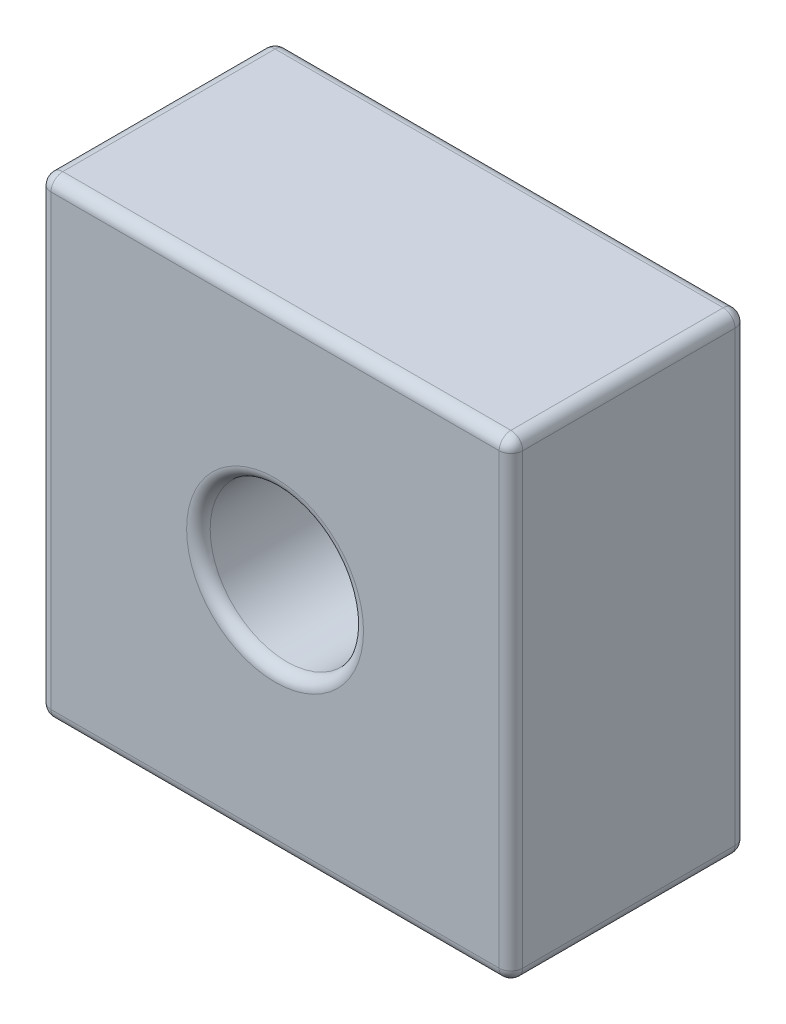
ISO-10303-21;
HEADER;
FILE_DESCRIPTION(('STEP AP214'),'2;1');
FILE_NAME('part.step','',(''),(''),'','','');
FILE_SCHEMA(('AUTOMOTIVE_DESIGN { 1 0 10303 214 1 1 1 1 }'));
ENDSEC;
DATA;
#1=APPLICATION_CONTEXT('core data for automotive mechanical design processes');
#2=APPLICATION_PROTOCOL_DEFINITION('international standard','automotive_design',2000,#1);
#3=PRODUCT_CONTEXT('',#1,'mechanical');
#4=PRODUCT('Part','Part','',(#3));
#5=PRODUCT_RELATED_PRODUCT_CATEGORY('part','',(#4));
#6=PRODUCT_DEFINITION_FORMATION('','',#4);
#7=PRODUCT_DEFINITION_CONTEXT('part definition',#1,'design');
#8=PRODUCT_DEFINITION('design','',#6,#7);
#9=PRODUCT_DEFINITION_SHAPE('','',#8);
#10=(LENGTH_UNIT() NAMED_UNIT(*) SI_UNIT(.MILLI.,.METRE.));
#11=(NAMED_UNIT(*) PLANE_ANGLE_UNIT() SI_UNIT($,.RADIAN.));
#12=(NAMED_UNIT(*) SI_UNIT($,.STERADIAN.) SOLID_ANGLE_UNIT());
#13=UNCERTAINTY_MEASURE_WITH_UNIT(LENGTH_MEASURE(1.E-05),#10,'distance_accuracy_value','');
#14=(GEOMETRIC_REPRESENTATION_CONTEXT(3) GLOBAL_UNCERTAINTY_ASSIGNED_CONTEXT((#13)) GLOBAL_UNIT_ASSIGNED_CONTEXT((#10,
#11,#12)) REPRESENTATION_CONTEXT('',''));
#15=CARTESIAN_POINT('',(0.,0.,0.));
#16=DIRECTION('',(0.,0.,1.));
#17=DIRECTION('',(1.,0.,0.));
#18=AXIS2_PLACEMENT_3D('',#15,#16,#17);
#19=CARTESIAN_POINT('',(0.,0.,10.));
#20=DIRECTION('',(0.,0.,1.));
#21=DIRECTION('',(1.,0.,0.));
#22=AXIS2_PLACEMENT_3D('',#19,#20,#21);
#23=PLANE('',#22);
#24=CARTESIAN_POINT('',(0.,0.,10.));
#25=DIRECTION('',(0.,0.,1.));
#26=DIRECTION('',(1.,0.,0.));
#27=AXIS2_PLACEMENT_3D('',#24,#25,#26);
#28=CIRCLE('',#27,3.75);
#29=CARTESIAN_POINT('',(3.75,0.,10.));
#30=VERTEX_POINT('',#29);
#31=EDGE_CURVE('E171',#30,#30,#28,.F.);
#32=ORIENTED_EDGE('',*,*,#31,.T.);
#33=EDGE_LOOP('',(#32));
#34=FACE_BOUND('',#33,.T.);
#35=DIRECTION('',(-1.,0.,0.));
#36=VECTOR('',#35,1.);
#37=CARTESIAN_POINT('',(-10.,9.50000000000001,10.));
#38=LINE('',#37,#36);
#39=CARTESIAN_POINT('',(9.5,9.50000000000001,10.));
#40=VERTEX_POINT('',#39);
#41=CARTESIAN_POINT('',(-9.5,9.50000000000001,10.));
#42=VERTEX_POINT('',#41);
#43=EDGE_CURVE('E135',#40,#42,#38,.T.);
#44=ORIENTED_EDGE('',*,*,#43,.T.);
#45=DIRECTION('',(0.,-1.,0.));
#46=VECTOR('',#45,1.);
#47=CARTESIAN_POINT('',(-9.5,-9.99999999999999,10.));
#48=LINE('',#47,#46);
#49=CARTESIAN_POINT('',(-9.5,-9.49999999999999,10.));
#50=VERTEX_POINT('',#49);
#51=EDGE_CURVE('E131',#42,#50,#48,.T.);
#52=ORIENTED_EDGE('',*,*,#51,.T.);
#53=DIRECTION('',(1.,0.,0.));
#54=VECTOR('',#53,1.);
#55=CARTESIAN_POINT('',(10.,-9.49999999999999,10.));
#56=LINE('',#55,#54);
#57=CARTESIAN_POINT('',(9.5,-9.49999999999999,10.));
#58=VERTEX_POINT('',#57);
#59=EDGE_CURVE('E124',#50,#58,#56,.T.);
#60=ORIENTED_EDGE('',*,*,#59,.T.);
#61=DIRECTION('',(0.,1.,0.));
#62=VECTOR('',#61,1.);
#63=CARTESIAN_POINT('',(9.5,10.,10.));
#64=LINE('',#63,#62);
#65=EDGE_CURVE('E128',#58,#40,#64,.T.);
#66=ORIENTED_EDGE('',*,*,#65,.T.);
#67=EDGE_LOOP('',(#44,#52,#60,#66));
#68=FACE_BOUND('',#67,.T.);
#69=ADVANCED_FACE('F33',(#34,#68),#23,.T.);
#70=CARTESIAN_POINT('',(0.,0.,0.));
#71=DIRECTION('',(0.,0.,1.));
#72=DIRECTION('',(1.,0.,0.));
#73=AXIS2_PLACEMENT_3D('',#70,#71,#72);
#74=PLANE('',#73);
#75=CARTESIAN_POINT('',(0.,0.,0.));
#76=DIRECTION('',(0.,0.,1.));
#77=DIRECTION('',(1.,0.,0.));
#78=AXIS2_PLACEMENT_3D('',#75,#76,#77);
#79=CIRCLE('',#78,3.75);
#80=CARTESIAN_POINT('',(3.75,0.,0.));
#81=VERTEX_POINT('',#80);
#82=EDGE_CURVE('E11',#81,#81,#79,.T.);
#83=ORIENTED_EDGE('',*,*,#82,.T.);
#84=EDGE_LOOP('',(#83));
#85=FACE_BOUND('',#84,.T.);
#86=DIRECTION('',(0.,1.,0.));
#87=VECTOR('',#86,1.);
#88=CARTESIAN_POINT('',(9.5,0.,0.));
#89=LINE('',#88,#87);
#90=CARTESIAN_POINT('',(9.5,9.50000000000001,0.));
#91=VERTEX_POINT('',#90);
#92=CARTESIAN_POINT('',(9.5,-9.49999999999999,0.));
#93=VERTEX_POINT('',#92);
#94=EDGE_CURVE('E212',#91,#93,#89,.F.);
#95=ORIENTED_EDGE('',*,*,#94,.T.);
#96=DIRECTION('',(1.,0.,0.));
#97=VECTOR('',#96,1.);
#98=CARTESIAN_POINT('',(0.,-9.49999999999999,0.));
#99=LINE('',#98,#97);
#100=CARTESIAN_POINT('',(-9.5,-9.49999999999999,0.));
#101=VERTEX_POINT('',#100);
#102=EDGE_CURVE('E42',#93,#101,#99,.F.);
#103=ORIENTED_EDGE('',*,*,#102,.T.);
#104=DIRECTION('',(0.,-1.,0.));
#105=VECTOR('',#104,1.);
#106=CARTESIAN_POINT('',(-9.5,0.,0.));
#107=LINE('',#106,#105);
#108=CARTESIAN_POINT('',(-9.5,9.50000000000001,0.));
#109=VERTEX_POINT('',#108);
#110=EDGE_CURVE('E210',#101,#109,#107,.F.);
#111=ORIENTED_EDGE('',*,*,#110,.T.);
#112=DIRECTION('',(-1.,0.,0.));
#113=VECTOR('',#112,1.);
#114=CARTESIAN_POINT('',(0.,9.50000000000001,0.));
#115=LINE('',#114,#113);
#116=EDGE_CURVE('E208',#109,#91,#115,.F.);
#117=ORIENTED_EDGE('',*,*,#116,.T.);
#118=EDGE_LOOP('',(#95,#103,#111,#117));
#119=FACE_BOUND('',#118,.T.);
#120=ADVANCED_FACE('F278',(#85,#119),#74,.F.);
#121=CARTESIAN_POINT('',(-10.,-9.99999999999999,10.));
#122=DIRECTION('',(1.,0.,0.));
#123=DIRECTION('',(0.,0.,-1.));
#124=AXIS2_PLACEMENT_3D('',#121,#122,#123);
#125=PLANE('',#124);
#126=DIRECTION('',(0.,-1.,0.));
#127=VECTOR('',#126,1.);
#128=CARTESIAN_POINT('',(-10.,10.,9.5));
#129=LINE('',#128,#127);
#130=CARTESIAN_POINT('',(-10.,-9.49999999999999,9.5));
#131=VERTEX_POINT('',#130);
#132=CARTESIAN_POINT('',(-10.,9.50000000000001,9.5));
#133=VERTEX_POINT('',#132);
#134=EDGE_CURVE('E194',#131,#133,#129,.F.);
#135=ORIENTED_EDGE('',*,*,#134,.T.);
#136=DIRECTION('',(0.,0.,-1.));
#137=VECTOR('',#136,1.);
#138=CARTESIAN_POINT('',(-10.,9.50000000000001,10.));
#139=LINE('',#138,#137);
#140=CARTESIAN_POINT('',(-10.,9.50000000000001,0.5));
#141=VERTEX_POINT('',#140);
#142=EDGE_CURVE('E197',#133,#141,#139,.T.);
#143=ORIENTED_EDGE('',*,*,#142,.T.);
#144=DIRECTION('',(0.,-1.,0.));
#145=VECTOR('',#144,1.);
#146=CARTESIAN_POINT('',(-10.,-9.99999999999999,0.5));
#147=LINE('',#146,#145);
#148=CARTESIAN_POINT('',(-10.,-9.49999999999999,0.5));
#149=VERTEX_POINT('',#148);
#150=EDGE_CURVE('E192',#141,#149,#147,.T.);
#151=ORIENTED_EDGE('',*,*,#150,.T.);
#152=DIRECTION('',(0.,0.,-1.));
#153=VECTOR('',#152,1.);
#154=CARTESIAN_POINT('',(-10.,-9.49999999999999,10.));
#155=LINE('',#154,#153);
#156=EDGE_CURVE('E190',#149,#131,#155,.F.);
#157=ORIENTED_EDGE('',*,*,#156,.T.);
#158=EDGE_LOOP('',(#135,#143,#151,#157));
#159=FACE_BOUND('',#158,.T.);
#160=ADVANCED_FACE('F280',(#159),#125,.F.);
#161=CARTESIAN_POINT('',(10.,-9.99999999999999,10.));
#162=DIRECTION('',(0.,1.,0.));
#163=DIRECTION('',(-1.,0.,0.));
#164=AXIS2_PLACEMENT_3D('',#161,#162,#163);
#165=PLANE('',#164);
#166=DIRECTION('',(0.,0.,-1.));
#167=VECTOR('',#166,1.);
#168=CARTESIAN_POINT('',(9.5,-9.99999999999999,10.));
#169=LINE('',#168,#167);
#170=CARTESIAN_POINT('',(9.5,-9.99999999999999,0.5));
#171=VERTEX_POINT('',#170);
#172=CARTESIAN_POINT('',(9.5,-9.99999999999999,9.5));
#173=VERTEX_POINT('',#172);
#174=EDGE_CURVE('E187',#171,#173,#169,.F.);
#175=ORIENTED_EDGE('',*,*,#174,.T.);
#176=DIRECTION('',(1.,0.,0.));
#177=VECTOR('',#176,1.);
#178=CARTESIAN_POINT('',(-10.,-9.99999999999999,9.5));
#179=LINE('',#178,#177);
#180=CARTESIAN_POINT('',(-9.5,-9.99999999999999,9.5));
#181=VERTEX_POINT('',#180);
#182=EDGE_CURVE('E143',#173,#181,#179,.F.);
#183=ORIENTED_EDGE('',*,*,#182,.T.);
#184=DIRECTION('',(0.,0.,-1.));
#185=VECTOR('',#184,1.);
#186=CARTESIAN_POINT('',(-9.5,-9.99999999999999,10.));
#187=LINE('',#186,#185);
#188=CARTESIAN_POINT('',(-9.5,-9.99999999999999,0.5));
#189=VERTEX_POINT('',#188);
#190=EDGE_CURVE('E183',#181,#189,#187,.T.);
#191=ORIENTED_EDGE('',*,*,#190,.T.);
#192=DIRECTION('',(1.,0.,0.));
#193=VECTOR('',#192,1.);
#194=CARTESIAN_POINT('',(10.,-9.99999999999999,0.5));
#195=LINE('',#194,#193);
#196=EDGE_CURVE('E185',#189,#171,#195,.T.);
#197=ORIENTED_EDGE('',*,*,#196,.T.);
#198=EDGE_LOOP('',(#175,#183,#191,#197));
#199=FACE_BOUND('',#198,.T.);
#200=ADVANCED_FACE('F307',(#199),#165,.F.);
#201=CARTESIAN_POINT('',(10.,-9.99999999999999,10.));
#202=DIRECTION('',(-1.,0.,0.));
#203=DIRECTION('',(0.,-1.,0.));
#204=AXIS2_PLACEMENT_3D('',#201,#202,#203);
#205=PLANE('',#204);
#206=DIRECTION('',(0.,1.,0.));
#207=VECTOR('',#206,1.);
#208=CARTESIAN_POINT('',(10.,-9.99999999999999,9.5));
#209=LINE('',#208,#207);
#210=CARTESIAN_POINT('',(10.,9.50000000000001,9.5));
#211=VERTEX_POINT('',#210);
#212=CARTESIAN_POINT('',(10.,-9.49999999999999,9.5));
#213=VERTEX_POINT('',#212);
#214=EDGE_CURVE('E203',#211,#213,#209,.F.);
#215=ORIENTED_EDGE('',*,*,#214,.T.);
#216=DIRECTION('',(0.,0.,-1.));
#217=VECTOR('',#216,1.);
#218=CARTESIAN_POINT('',(10.,-9.49999999999999,10.));
#219=LINE('',#218,#217);
#220=CARTESIAN_POINT('',(10.,-9.49999999999999,0.5));
#221=VERTEX_POINT('',#220);
#222=EDGE_CURVE('E205',#213,#221,#219,.T.);
#223=ORIENTED_EDGE('',*,*,#222,.T.);
#224=DIRECTION('',(0.,1.,0.));
#225=VECTOR('',#224,1.);
#226=CARTESIAN_POINT('',(10.,-9.99999999999999,0.5));
#227=LINE('',#226,#225);
#228=CARTESIAN_POINT('',(10.,9.50000000000001,0.5));
#229=VERTEX_POINT('',#228);
#230=EDGE_CURVE('E199',#221,#229,#227,.T.);
#231=ORIENTED_EDGE('',*,*,#230,.T.);
#232=DIRECTION('',(0.,0.,-1.));
#233=VECTOR('',#232,1.);
#234=CARTESIAN_POINT('',(10.,9.50000000000001,10.));
#235=LINE('',#234,#233);
#236=EDGE_CURVE('E201',#229,#211,#235,.F.);
#237=ORIENTED_EDGE('',*,*,#236,.T.);
#238=EDGE_LOOP('',(#215,#223,#231,#237));
#239=FACE_BOUND('',#238,.T.);
#240=ADVANCED_FACE('F300',(#239),#205,.F.);
#241=CARTESIAN_POINT('',(10.,10.,10.));
#242=DIRECTION('',(0.,-1.,0.));
#243=DIRECTION('',(1.,0.,0.));
#244=AXIS2_PLACEMENT_3D('',#241,#242,#243);
#245=PLANE('',#244);
#246=DIRECTION('',(0.,0.,-1.));
#247=VECTOR('',#246,1.);
#248=CARTESIAN_POINT('',(-9.5,10.,10.));
#249=LINE('',#248,#247);
#250=CARTESIAN_POINT('',(-9.5,10.,0.5));
#251=VERTEX_POINT('',#250);
#252=CARTESIAN_POINT('',(-9.5,10.,9.5));
#253=VERTEX_POINT('',#252);
#254=EDGE_CURVE('E174',#251,#253,#249,.F.);
#255=ORIENTED_EDGE('',*,*,#254,.T.);
#256=DIRECTION('',(-1.,0.,0.));
#257=VECTOR('',#256,1.);
#258=CARTESIAN_POINT('',(10.,10.,9.5));
#259=LINE('',#258,#257);
#260=CARTESIAN_POINT('',(9.5,10.,9.5));
#261=VERTEX_POINT('',#260);
#262=EDGE_CURVE('E180',#253,#261,#259,.F.);
#263=ORIENTED_EDGE('',*,*,#262,.T.);
#264=DIRECTION('',(0.,0.,-1.));
#265=VECTOR('',#264,1.);
#266=CARTESIAN_POINT('',(9.5,10.,10.));
#267=LINE('',#266,#265);
#268=CARTESIAN_POINT('',(9.5,10.,0.5));
#269=VERTEX_POINT('',#268);
#270=EDGE_CURVE('E178',#261,#269,#267,.T.);
#271=ORIENTED_EDGE('',*,*,#270,.T.);
#272=DIRECTION('',(-1.,0.,0.));
#273=VECTOR('',#272,1.);
#274=CARTESIAN_POINT('',(10.,10.,0.5));
#275=LINE('',#274,#273);
#276=EDGE_CURVE('E176',#269,#251,#275,.T.);
#277=ORIENTED_EDGE('',*,*,#276,.T.);
#278=EDGE_LOOP('',(#255,#263,#271,#277));
#279=FACE_BOUND('',#278,.T.);
#280=ADVANCED_FACE('F328',(#279),#245,.F.);
#281=CARTESIAN_POINT('',(0.,0.,10.));
#282=DIRECTION('',(0.,0.,-1.));
#283=DIRECTION('',(-1.,0.,0.));
#284=AXIS2_PLACEMENT_3D('',#281,#282,#283);
#285=CYLINDRICAL_SURFACE('',#284,3.25);
#286=CARTESIAN_POINT('',(0.,0.,9.5));
#287=DIRECTION('',(0.,0.,1.));
#288=DIRECTION('',(1.,0.,0.));
#289=AXIS2_PLACEMENT_3D('',#286,#287,#288);
#290=CIRCLE('',#289,3.25);
#291=CARTESIAN_POINT('',(3.25,0.,9.5));
#292=VERTEX_POINT('',#291);
#293=EDGE_CURVE('E162',#292,#292,#290,.T.);
#294=ORIENTED_EDGE('',*,*,#293,.T.);
#295=EDGE_LOOP('',(#294));
#296=FACE_BOUND('',#295,.T.);
#297=CARTESIAN_POINT('',(0.,0.,0.5));
#298=DIRECTION('',(0.,0.,1.));
#299=DIRECTION('',(1.,0.,0.));
#300=AXIS2_PLACEMENT_3D('',#297,#298,#299);
#301=CIRCLE('',#300,3.25);
#302=CARTESIAN_POINT('',(3.25,0.,0.5));
#303=VERTEX_POINT('',#302);
#304=EDGE_CURVE('E165',#303,#303,#301,.F.);
#305=ORIENTED_EDGE('',*,*,#304,.T.);
#306=EDGE_LOOP('',(#305));
#307=FACE_BOUND('',#306,.T.);
#308=ADVANCED_FACE('F271',(#296,#307),#285,.F.);
#309=CARTESIAN_POINT('',(0.,0.,9.5));
#310=DIRECTION('',(0.,0.,1.));
#311=DIRECTION('',(1.,0.,0.));
#312=AXIS2_PLACEMENT_3D('',#309,#310,#311);
#313=TOROIDAL_SURFACE('',#312,3.75,0.5);
#314=ORIENTED_EDGE('',*,*,#31,.F.);
#315=EDGE_LOOP('',(#314));
#316=FACE_BOUND('',#315,.T.);
#317=ORIENTED_EDGE('',*,*,#293,.F.);
#318=EDGE_LOOP('',(#317));
#319=FACE_BOUND('',#318,.T.);
#320=ADVANCED_FACE('F376',(#316,#319),#313,.T.);
#321=CARTESIAN_POINT('',(10.,-9.49999999999999,0.5));
#322=DIRECTION('',(1.,0.,0.));
#323=DIRECTION('',(0.,1.,0.));
#324=AXIS2_PLACEMENT_3D('',#321,#322,#323);
#325=CYLINDRICAL_SURFACE('',#324,0.5);
#326=CARTESIAN_POINT('',(9.5,-9.49999999999999,0.5));
#327=DIRECTION('',(1.,0.,0.));
#328=DIRECTION('',(0.,0.,-1.));
#329=AXIS2_PLACEMENT_3D('',#326,#327,#328);
#330=CIRCLE('',#329,0.5);
#331=EDGE_CURVE('E37',#171,#93,#330,.T.);
#332=ORIENTED_EDGE('',*,*,#331,.F.);
#333=ORIENTED_EDGE('',*,*,#196,.F.);
#334=CARTESIAN_POINT('',(-9.5,-9.49999999999999,0.5));
#335=DIRECTION('',(-1.,0.,0.));
#336=DIRECTION('',(0.,-1.,0.));
#337=AXIS2_PLACEMENT_3D('',#334,#335,#336);
#338=CIRCLE('',#337,0.5);
#339=EDGE_CURVE('E260',#101,#189,#338,.T.);
#340=ORIENTED_EDGE('',*,*,#339,.F.);
#341=ORIENTED_EDGE('',*,*,#102,.F.);
#342=EDGE_LOOP('',(#332,#333,#340,#341));
#343=FACE_BOUND('',#342,.T.);
#344=ADVANCED_FACE('F311',(#343),#325,.T.);
#345=CARTESIAN_POINT('',(9.5,-9.49999999999999,0.5));
#346=DIRECTION('',(0.,0.,1.));
#347=DIRECTION('',(1.,0.,0.));
#348=AXIS2_PLACEMENT_3D('',#345,#346,#347);
#349=SPHERICAL_SURFACE('',#348,0.5);
#350=CARTESIAN_POINT('',(9.5,-9.49999999999999,0.5));
#351=DIRECTION('',(0.,0.,-1.));
#352=DIRECTION('',(-1.,0.,0.));
#353=AXIS2_PLACEMENT_3D('',#350,#351,#352);
#354=CIRCLE('',#353,0.5);
#355=EDGE_CURVE('E257',#171,#221,#354,.F.);
#356=ORIENTED_EDGE('',*,*,#355,.F.);
#357=ORIENTED_EDGE('',*,*,#331,.T.);
#358=CARTESIAN_POINT('',(9.5,-9.49999999999999,0.5));
#359=DIRECTION('',(0.,-1.,0.));
#360=DIRECTION('',(0.,0.,-1.));
#361=AXIS2_PLACEMENT_3D('',#358,#359,#360);
#362=CIRCLE('',#361,0.5);
#363=EDGE_CURVE('E50',#221,#93,#362,.F.);
#364=ORIENTED_EDGE('',*,*,#363,.F.);
#365=EDGE_LOOP('',(#356,#357,#364));
#366=FACE_BOUND('',#365,.T.);
#367=ADVANCED_FACE('F302',(#366),#349,.T.);
#368=CARTESIAN_POINT('',(-9.5,-9.49999999999999,0.5));
#369=DIRECTION('',(0.,0.,1.));
#370=DIRECTION('',(1.,0.,0.));
#371=AXIS2_PLACEMENT_3D('',#368,#369,#370);
#372=SPHERICAL_SURFACE('',#371,0.5);
#373=CARTESIAN_POINT('',(-9.5,-9.49999999999999,0.5));
#374=DIRECTION('',(0.,-1.,0.));
#375=DIRECTION('',(0.,0.,-1.));
#376=AXIS2_PLACEMENT_3D('',#373,#374,#375);
#377=CIRCLE('',#376,0.5);
#378=EDGE_CURVE('E251',#101,#149,#377,.F.);
#379=ORIENTED_EDGE('',*,*,#378,.F.);
#380=ORIENTED_EDGE('',*,*,#339,.T.);
#381=CARTESIAN_POINT('',(-9.5,-9.49999999999999,0.5));
#382=DIRECTION('',(0.,0.,-1.));
#383=DIRECTION('',(-1.,0.,0.));
#384=AXIS2_PLACEMENT_3D('',#381,#382,#383);
#385=CIRCLE('',#384,0.5);
#386=EDGE_CURVE('E254',#149,#189,#385,.F.);
#387=ORIENTED_EDGE('',*,*,#386,.F.);
#388=EDGE_LOOP('',(#379,#380,#387));
#389=FACE_BOUND('',#388,.T.);
#390=ADVANCED_FACE('F313',(#389),#372,.T.);
#391=CARTESIAN_POINT('',(9.5,-9.99999999999999,0.5));
#392=DIRECTION('',(0.,1.,0.));
#393=DIRECTION('',(-1.,0.,0.));
#394=AXIS2_PLACEMENT_3D('',#391,#392,#393);
#395=CYLINDRICAL_SURFACE('',#394,0.5);
#396=ORIENTED_EDGE('',*,*,#363,.T.);
#397=ORIENTED_EDGE('',*,*,#94,.F.);
#398=CARTESIAN_POINT('',(9.5,9.50000000000001,0.5));
#399=DIRECTION('',(0.,1.,0.));
#400=DIRECTION('',(0.,0.,1.));
#401=AXIS2_PLACEMENT_3D('',#398,#399,#400);
#402=CIRCLE('',#401,0.5);
#403=EDGE_CURVE('E245',#229,#91,#402,.T.);
#404=ORIENTED_EDGE('',*,*,#403,.F.);
#405=ORIENTED_EDGE('',*,*,#230,.F.);
#406=EDGE_LOOP('',(#396,#397,#404,#405));
#407=FACE_BOUND('',#406,.T.);
#408=ADVANCED_FACE('F285',(#407),#395,.T.);
#409=CARTESIAN_POINT('',(9.5,-9.49999999999999,10.));
#410=DIRECTION('',(0.,0.,-1.));
#411=DIRECTION('',(-1.,0.,0.));
#412=AXIS2_PLACEMENT_3D('',#409,#410,#411);
#413=CYLINDRICAL_SURFACE('',#412,0.5);
#414=ORIENTED_EDGE('',*,*,#355,.T.);
#415=ORIENTED_EDGE('',*,*,#222,.F.);
#416=CARTESIAN_POINT('',(9.5,-9.49999999999999,9.5));
#417=DIRECTION('',(0.,0.,1.));
#418=DIRECTION('',(1.,0.,0.));
#419=AXIS2_PLACEMENT_3D('',#416,#417,#418);
#420=CIRCLE('',#419,0.5);
#421=EDGE_CURVE('E147',#173,#213,#420,.T.);
#422=ORIENTED_EDGE('',*,*,#421,.F.);
#423=ORIENTED_EDGE('',*,*,#174,.F.);
#424=EDGE_LOOP('',(#414,#415,#422,#423));
#425=FACE_BOUND('',#424,.T.);
#426=ADVANCED_FACE('F305',(#425),#413,.T.);
#427=CARTESIAN_POINT('',(0.,-9.49999999999999,9.5));
#428=DIRECTION('',(-1.,0.,0.));
#429=DIRECTION('',(0.,-1.,0.));
#430=AXIS2_PLACEMENT_3D('',#427,#428,#429);
#431=CYLINDRICAL_SURFACE('',#430,0.5);
#432=CARTESIAN_POINT('',(-9.5,-9.49999999999999,9.5));
#433=DIRECTION('',(-1.,0.,0.));
#434=DIRECTION('',(0.,0.,1.));
#435=AXIS2_PLACEMENT_3D('',#432,#433,#434);
#436=CIRCLE('',#435,0.5);
#437=EDGE_CURVE('E148',#181,#50,#436,.T.);
#438=ORIENTED_EDGE('',*,*,#437,.F.);
#439=ORIENTED_EDGE('',*,*,#182,.F.);
#440=CARTESIAN_POINT('',(9.5,-9.49999999999999,9.5));
#441=DIRECTION('',(1.,0.,0.));
#442=DIRECTION('',(0.,0.,-1.));
#443=AXIS2_PLACEMENT_3D('',#440,#441,#442);
#444=CIRCLE('',#443,0.5);
#445=EDGE_CURVE('E139',#58,#173,#444,.T.);
#446=ORIENTED_EDGE('',*,*,#445,.F.);
#447=ORIENTED_EDGE('',*,*,#59,.F.);
#448=EDGE_LOOP('',(#438,#439,#446,#447));
#449=FACE_BOUND('',#448,.T.);
#450=ADVANCED_FACE('F141',(#449),#431,.T.);
#451=CARTESIAN_POINT('',(-9.5,-9.49999999999999,10.));
#452=DIRECTION('',(0.,0.,-1.));
#453=DIRECTION('',(-1.,0.,0.));
#454=AXIS2_PLACEMENT_3D('',#451,#452,#453);
#455=CYLINDRICAL_SURFACE('',#454,0.5);
#456=ORIENTED_EDGE('',*,*,#386,.T.);
#457=ORIENTED_EDGE('',*,*,#190,.F.);
#458=CARTESIAN_POINT('',(-9.5,-9.49999999999999,9.5));
#459=DIRECTION('',(0.,0.,1.));
#460=DIRECTION('',(1.,0.,0.));
#461=AXIS2_PLACEMENT_3D('',#458,#459,#460);
#462=CIRCLE('',#461,0.5);
#463=EDGE_CURVE('E241',#131,#181,#462,.T.);
#464=ORIENTED_EDGE('',*,*,#463,.F.);
#465=ORIENTED_EDGE('',*,*,#156,.F.);
#466=EDGE_LOOP('',(#456,#457,#464,#465));
#467=FACE_BOUND('',#466,.T.);
#468=ADVANCED_FACE('F343',(#467),#455,.T.);
#469=CARTESIAN_POINT('',(-9.5,-9.99999999999999,0.5));
#470=DIRECTION('',(0.,-1.,0.));
#471=DIRECTION('',(0.,0.,-1.));
#472=AXIS2_PLACEMENT_3D('',#469,#470,#471);
#473=CYLINDRICAL_SURFACE('',#472,0.5);
#474=ORIENTED_EDGE('',*,*,#378,.T.);
#475=ORIENTED_EDGE('',*,*,#150,.F.);
#476=CARTESIAN_POINT('',(-9.5,9.50000000000001,0.5));
#477=DIRECTION('',(0.,1.,0.));
#478=DIRECTION('',(0.,0.,1.));
#479=AXIS2_PLACEMENT_3D('',#476,#477,#478);
#480=CIRCLE('',#479,0.5);
#481=EDGE_CURVE('E238',#109,#141,#480,.T.);
#482=ORIENTED_EDGE('',*,*,#481,.F.);
#483=ORIENTED_EDGE('',*,*,#110,.F.);
#484=EDGE_LOOP('',(#474,#475,#482,#483));
#485=FACE_BOUND('',#484,.T.);
#486=ADVANCED_FACE('F317',(#485),#473,.T.);
#487=CARTESIAN_POINT('',(10.,9.50000000000001,0.5));
#488=DIRECTION('',(-1.,0.,0.));
#489=DIRECTION('',(0.,-1.,0.));
#490=AXIS2_PLACEMENT_3D('',#487,#488,#489);
#491=CYLINDRICAL_SURFACE('',#490,0.5);
#492=CARTESIAN_POINT('',(9.5,9.50000000000001,0.5));
#493=DIRECTION('',(1.,0.,0.));
#494=DIRECTION('',(0.,0.,-1.));
#495=AXIS2_PLACEMENT_3D('',#492,#493,#494);
#496=CIRCLE('',#495,0.5);
#497=EDGE_CURVE('E248',#91,#269,#496,.T.);
#498=ORIENTED_EDGE('',*,*,#497,.F.);
#499=ORIENTED_EDGE('',*,*,#116,.F.);
#500=CARTESIAN_POINT('',(-9.5,9.50000000000001,0.5));
#501=DIRECTION('',(-1.,0.,0.));
#502=DIRECTION('',(0.,0.,1.));
#503=AXIS2_PLACEMENT_3D('',#500,#501,#502);
#504=CIRCLE('',#503,0.5);
#505=EDGE_CURVE('E235',#251,#109,#504,.T.);
#506=ORIENTED_EDGE('',*,*,#505,.F.);
#507=ORIENTED_EDGE('',*,*,#276,.F.);
#508=EDGE_LOOP('',(#498,#499,#506,#507));
#509=FACE_BOUND('',#508,.T.);
#510=ADVANCED_FACE('F289',(#509),#491,.T.);
#511=CARTESIAN_POINT('',(9.5,9.50000000000001,0.5));
#512=DIRECTION('',(0.,0.,1.));
#513=DIRECTION('',(1.,0.,0.));
#514=AXIS2_PLACEMENT_3D('',#511,#512,#513);
#515=SPHERICAL_SURFACE('',#514,0.5);
#516=ORIENTED_EDGE('',*,*,#403,.T.);
#517=ORIENTED_EDGE('',*,*,#497,.T.);
#518=CARTESIAN_POINT('',(9.5,9.50000000000001,0.5));
#519=DIRECTION('',(0.,0.,-1.));
#520=DIRECTION('',(-1.,0.,0.));
#521=AXIS2_PLACEMENT_3D('',#518,#519,#520);
#522=CIRCLE('',#521,0.5);
#523=EDGE_CURVE('E155',#229,#269,#522,.F.);
#524=ORIENTED_EDGE('',*,*,#523,.F.);
#525=EDGE_LOOP('',(#516,#517,#524));
#526=FACE_BOUND('',#525,.T.);
#527=ADVANCED_FACE('F293',(#526),#515,.T.);
#528=CARTESIAN_POINT('',(9.5,-9.49999999999999,9.5));
#529=DIRECTION('',(0.,0.,1.));
#530=DIRECTION('',(1.,0.,0.));
#531=AXIS2_PLACEMENT_3D('',#528,#529,#530);
#532=SPHERICAL_SURFACE('',#531,0.5);
#533=ORIENTED_EDGE('',*,*,#445,.T.);
#534=ORIENTED_EDGE('',*,*,#421,.T.);
#535=CARTESIAN_POINT('',(9.5,-9.49999999999999,9.5));
#536=DIRECTION('',(0.,-1.,0.));
#537=DIRECTION('',(0.,0.,-1.));
#538=AXIS2_PLACEMENT_3D('',#535,#536,#537);
#539=CIRCLE('',#538,0.5);
#540=EDGE_CURVE('E151',#58,#213,#539,.F.);
#541=ORIENTED_EDGE('',*,*,#540,.F.);
#542=EDGE_LOOP('',(#533,#534,#541));
#543=FACE_BOUND('',#542,.T.);
#544=ADVANCED_FACE('F152',(#543),#532,.T.);
#545=CARTESIAN_POINT('',(-9.5,-9.49999999999999,9.5));
#546=DIRECTION('',(0.,0.,1.));
#547=DIRECTION('',(1.,0.,0.));
#548=AXIS2_PLACEMENT_3D('',#545,#546,#547);
#549=SPHERICAL_SURFACE('',#548,0.5);
#550=ORIENTED_EDGE('',*,*,#463,.T.);
#551=ORIENTED_EDGE('',*,*,#437,.T.);
#552=CARTESIAN_POINT('',(-9.5,-9.49999999999999,9.5));
#553=DIRECTION('',(0.,-1.,0.));
#554=DIRECTION('',(0.,0.,-1.));
#555=AXIS2_PLACEMENT_3D('',#552,#553,#554);
#556=CIRCLE('',#555,0.5);
#557=EDGE_CURVE('E156',#131,#50,#556,.F.);
#558=ORIENTED_EDGE('',*,*,#557,.F.);
#559=EDGE_LOOP('',(#550,#551,#558));
#560=FACE_BOUND('',#559,.T.);
#561=ADVANCED_FACE('F340',(#560),#549,.T.);
#562=CARTESIAN_POINT('',(-9.5,9.50000000000001,0.5));
#563=DIRECTION('',(0.,0.,1.));
#564=DIRECTION('',(1.,0.,0.));
#565=AXIS2_PLACEMENT_3D('',#562,#563,#564);
#566=SPHERICAL_SURFACE('',#565,0.5);
#567=ORIENTED_EDGE('',*,*,#505,.T.);
#568=ORIENTED_EDGE('',*,*,#481,.T.);
#569=CARTESIAN_POINT('',(-9.5,9.50000000000001,0.5));
#570=DIRECTION('',(0.,0.,-1.));
#571=DIRECTION('',(-1.,0.,0.));
#572=AXIS2_PLACEMENT_3D('',#569,#570,#571);
#573=CIRCLE('',#572,0.5);
#574=EDGE_CURVE('E228',#251,#141,#573,.F.);
#575=ORIENTED_EDGE('',*,*,#574,.F.);
#576=EDGE_LOOP('',(#567,#568,#575));
#577=FACE_BOUND('',#576,.T.);
#578=ADVANCED_FACE('F320',(#577),#566,.T.);
#579=CARTESIAN_POINT('',(9.5,9.50000000000001,10.));
#580=DIRECTION('',(0.,0.,-1.));
#581=DIRECTION('',(-1.,0.,0.));
#582=AXIS2_PLACEMENT_3D('',#579,#580,#581);
#583=CYLINDRICAL_SURFACE('',#582,0.5);
#584=ORIENTED_EDGE('',*,*,#523,.T.);
#585=ORIENTED_EDGE('',*,*,#270,.F.);
#586=CARTESIAN_POINT('',(9.5,9.50000000000001,9.5));
#587=DIRECTION('',(0.,0.,1.));
#588=DIRECTION('',(1.,0.,0.));
#589=AXIS2_PLACEMENT_3D('',#586,#587,#588);
#590=CIRCLE('',#589,0.5);
#591=EDGE_CURVE('E225',#211,#261,#590,.T.);
#592=ORIENTED_EDGE('',*,*,#591,.F.);
#593=ORIENTED_EDGE('',*,*,#236,.F.);
#594=EDGE_LOOP('',(#584,#585,#592,#593));
#595=FACE_BOUND('',#594,.T.);
#596=ADVANCED_FACE('F298',(#595),#583,.T.);
#597=CARTESIAN_POINT('',(9.5,0.,9.5));
#598=DIRECTION('',(0.,-1.,0.));
#599=DIRECTION('',(1.,0.,0.));
#600=AXIS2_PLACEMENT_3D('',#597,#598,#599);
#601=CYLINDRICAL_SURFACE('',#600,0.5);
#602=ORIENTED_EDGE('',*,*,#540,.T.);
#603=ORIENTED_EDGE('',*,*,#214,.F.);
#604=CARTESIAN_POINT('',(9.5,9.50000000000001,9.5));
#605=DIRECTION('',(0.,1.,0.));
#606=DIRECTION('',(0.,0.,1.));
#607=AXIS2_PLACEMENT_3D('',#604,#605,#606);
#608=CIRCLE('',#607,0.5);
#609=EDGE_CURVE('E160',#40,#211,#608,.T.);
#610=ORIENTED_EDGE('',*,*,#609,.F.);
#611=ORIENTED_EDGE('',*,*,#65,.F.);
#612=EDGE_LOOP('',(#602,#603,#610,#611));
#613=FACE_BOUND('',#612,.T.);
#614=ADVANCED_FACE('F158',(#613),#601,.T.);
#615=CARTESIAN_POINT('',(-9.5,0.,9.5));
#616=DIRECTION('',(0.,1.,0.));
#617=DIRECTION('',(0.,0.,1.));
#618=AXIS2_PLACEMENT_3D('',#615,#616,#617);
#619=CYLINDRICAL_SURFACE('',#618,0.5);
#620=ORIENTED_EDGE('',*,*,#557,.T.);
#621=ORIENTED_EDGE('',*,*,#51,.F.);
#622=CARTESIAN_POINT('',(-9.5,9.50000000000001,9.5));
#623=DIRECTION('',(0.,1.,0.));
#624=DIRECTION('',(0.,0.,1.));
#625=AXIS2_PLACEMENT_3D('',#622,#623,#624);
#626=CIRCLE('',#625,0.5);
#627=EDGE_CURVE('E221',#133,#42,#626,.T.);
#628=ORIENTED_EDGE('',*,*,#627,.F.);
#629=ORIENTED_EDGE('',*,*,#134,.F.);
#630=EDGE_LOOP('',(#620,#621,#628,#629));
#631=FACE_BOUND('',#630,.T.);
#632=ADVANCED_FACE('F337',(#631),#619,.T.);
#633=CARTESIAN_POINT('',(-9.5,9.50000000000001,10.));
#634=DIRECTION('',(0.,0.,-1.));
#635=DIRECTION('',(-1.,0.,0.));
#636=AXIS2_PLACEMENT_3D('',#633,#634,#635);
#637=CYLINDRICAL_SURFACE('',#636,0.5);
#638=ORIENTED_EDGE('',*,*,#574,.T.);
#639=ORIENTED_EDGE('',*,*,#142,.F.);
#640=CARTESIAN_POINT('',(-9.5,9.50000000000001,9.5));
#641=DIRECTION('',(0.,0.,1.));
#642=DIRECTION('',(1.,0.,0.));
#643=AXIS2_PLACEMENT_3D('',#640,#641,#642);
#644=CIRCLE('',#643,0.5);
#645=EDGE_CURVE('E219',#253,#133,#644,.T.);
#646=ORIENTED_EDGE('',*,*,#645,.F.);
#647=ORIENTED_EDGE('',*,*,#254,.F.);
#648=EDGE_LOOP('',(#638,#639,#646,#647));
#649=FACE_BOUND('',#648,.T.);
#650=ADVANCED_FACE('F325',(#649),#637,.T.);
#651=CARTESIAN_POINT('',(9.5,9.50000000000001,9.5));
#652=DIRECTION('',(0.,0.,1.));
#653=DIRECTION('',(1.,0.,0.));
#654=AXIS2_PLACEMENT_3D('',#651,#652,#653);
#655=SPHERICAL_SURFACE('',#654,0.5);
#656=ORIENTED_EDGE('',*,*,#609,.T.);
#657=ORIENTED_EDGE('',*,*,#591,.T.);
#658=CARTESIAN_POINT('',(9.5,9.50000000000001,9.5));
#659=DIRECTION('',(1.,0.,0.));
#660=DIRECTION('',(0.,0.,-1.));
#661=AXIS2_PLACEMENT_3D('',#658,#659,#660);
#662=CIRCLE('',#661,0.5);
#663=EDGE_CURVE('E217',#40,#261,#662,.F.);
#664=ORIENTED_EDGE('',*,*,#663,.F.);
#665=EDGE_LOOP('',(#656,#657,#664));
#666=FACE_BOUND('',#665,.T.);
#667=ADVANCED_FACE('F484',(#666),#655,.T.);
#668=CARTESIAN_POINT('',(-9.5,9.50000000000001,9.5));
#669=DIRECTION('',(0.,0.,1.));
#670=DIRECTION('',(1.,0.,0.));
#671=AXIS2_PLACEMENT_3D('',#668,#669,#670);
#672=SPHERICAL_SURFACE('',#671,0.5);
#673=ORIENTED_EDGE('',*,*,#645,.T.);
#674=ORIENTED_EDGE('',*,*,#627,.T.);
#675=CARTESIAN_POINT('',(-9.5,9.50000000000001,9.5));
#676=DIRECTION('',(-1.,0.,0.));
#677=DIRECTION('',(0.,0.,1.));
#678=AXIS2_PLACEMENT_3D('',#675,#676,#677);
#679=CIRCLE('',#678,0.5);
#680=EDGE_CURVE('E215',#253,#42,#679,.F.);
#681=ORIENTED_EDGE('',*,*,#680,.F.);
#682=EDGE_LOOP('',(#673,#674,#681));
#683=FACE_BOUND('',#682,.T.);
#684=ADVANCED_FACE('F333',(#683),#672,.T.);
#685=CARTESIAN_POINT('',(0.,9.50000000000001,9.5));
#686=DIRECTION('',(1.,0.,0.));
#687=DIRECTION('',(0.,1.,0.));
#688=AXIS2_PLACEMENT_3D('',#685,#686,#687);
#689=CYLINDRICAL_SURFACE('',#688,0.5);
#690=ORIENTED_EDGE('',*,*,#663,.T.);
#691=ORIENTED_EDGE('',*,*,#262,.F.);
#692=ORIENTED_EDGE('',*,*,#680,.T.);
#693=ORIENTED_EDGE('',*,*,#43,.F.);
#694=EDGE_LOOP('',(#690,#691,#692,#693));
#695=FACE_BOUND('',#694,.T.);
#696=ADVANCED_FACE('F275',(#695),#689,.T.);
#697=CARTESIAN_POINT('',(0.,0.,0.5));
#698=DIRECTION('',(0.,0.,1.));
#699=DIRECTION('',(1.,0.,0.));
#700=AXIS2_PLACEMENT_3D('',#697,#698,#699);
#701=TOROIDAL_SURFACE('',#700,3.75,0.5);
#702=ORIENTED_EDGE('',*,*,#304,.F.);
#703=EDGE_LOOP('',(#702));
#704=FACE_BOUND('',#703,.T.);
#705=ORIENTED_EDGE('',*,*,#82,.F.);
#706=EDGE_LOOP('',(#705));
#707=FACE_BOUND('',#706,.T.);
#708=ADVANCED_FACE('F35',(#704,#707),#701,.T.);
#709=CLOSED_SHELL('',(#69,#120,#160,#200,#240,#280,#308,#320,#344,#367,#390,#408,#426,#450,#468,
#486,#510,#527,#544,#561,#578,#596,#614,#632,#650,#667,#684,#696,#708));
#710=MANIFOLD_SOLID_BREP('B2',#709);
#711=ADVANCED_BREP_SHAPE_REPRESENTATION('',(#18,#710),#14);
#712=SHAPE_DEFINITION_REPRESENTATION(#9,#711);
ENDSEC;
END-ISO-10303-21;
